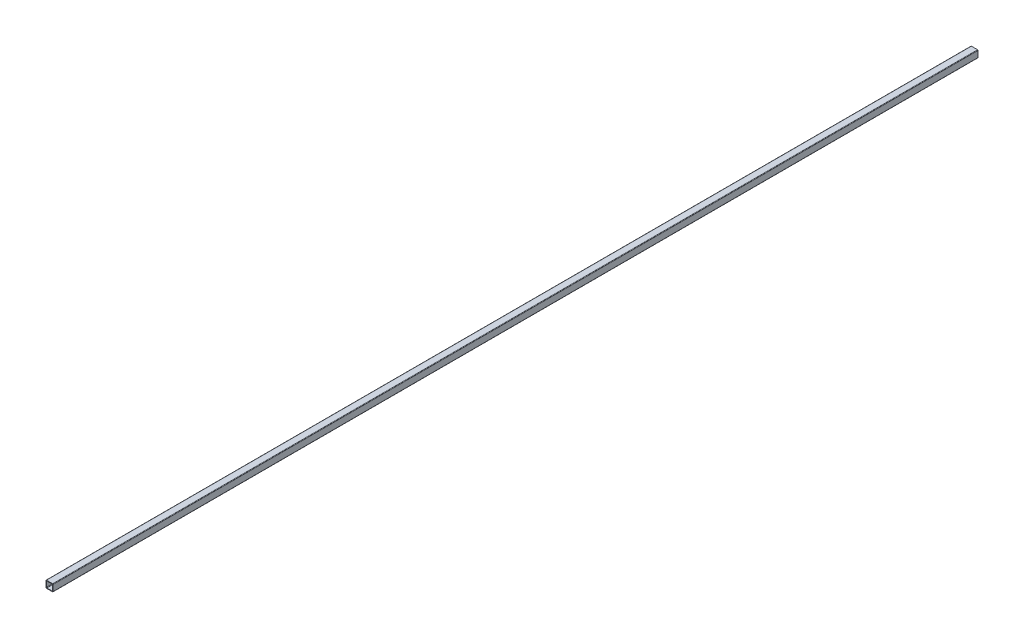
ISO-10303-21;
HEADER;
FILE_DESCRIPTION(('STEP AP214'),'2;1');
FILE_NAME('part.step','',(''),(''),'','','');
FILE_SCHEMA(('AUTOMOTIVE_DESIGN { 1 0 10303 214 1 1 1 1 }'));
ENDSEC;
DATA;
#1=APPLICATION_CONTEXT('core data for automotive mechanical design processes');
#2=APPLICATION_PROTOCOL_DEFINITION('international standard','automotive_design',2000,#1);
#3=PRODUCT_CONTEXT('',#1,'mechanical');
#4=PRODUCT('Part','Part','',(#3));
#5=PRODUCT_RELATED_PRODUCT_CATEGORY('part','',(#4));
#6=PRODUCT_DEFINITION_FORMATION('','',#4);
#7=PRODUCT_DEFINITION_CONTEXT('part definition',#1,'design');
#8=PRODUCT_DEFINITION('design','',#6,#7);
#9=PRODUCT_DEFINITION_SHAPE('','',#8);
#10=(LENGTH_UNIT() NAMED_UNIT(*) SI_UNIT(.MILLI.,.METRE.));
#11=(NAMED_UNIT(*) PLANE_ANGLE_UNIT() SI_UNIT($,.RADIAN.));
#12=(NAMED_UNIT(*) SI_UNIT($,.STERADIAN.) SOLID_ANGLE_UNIT());
#13=UNCERTAINTY_MEASURE_WITH_UNIT(LENGTH_MEASURE(1.E-05),#10,'distance_accuracy_value','');
#14=(GEOMETRIC_REPRESENTATION_CONTEXT(3) GLOBAL_UNCERTAINTY_ASSIGNED_CONTEXT((#13)) GLOBAL_UNIT_ASSIGNED_CONTEXT((#10,
#11,#12)) REPRESENTATION_CONTEXT('',''));
#15=CARTESIAN_POINT('',(0.,0.,0.));
#16=DIRECTION('',(0.,0.,1.));
#17=DIRECTION('',(1.,0.,0.));
#18=AXIS2_PLACEMENT_3D('',#15,#16,#17);
#19=CARTESIAN_POINT('',(2.54,-35.56,5000.));
#20=DIRECTION('',(0.,0.,1.));
#21=DIRECTION('',(1.,0.,0.));
#22=AXIS2_PLACEMENT_3D('',#19,#20,#21);
#23=PLANE('',#22);
#24=CARTESIAN_POINT('',(2.54,-35.56,5000.));
#25=DIRECTION('',(0.,0.,1.));
#26=DIRECTION('',(1.,0.,0.));
#27=AXIS2_PLACEMENT_3D('',#24,#25,#26);
#28=CIRCLE('',#27,2.54);
#29=CARTESIAN_POINT('',(0.,-35.56,5000.));
#30=VERTEX_POINT('',#29);
#31=CARTESIAN_POINT('',(2.54000000000002,-38.1,5000.));
#32=VERTEX_POINT('',#31);
#33=EDGE_CURVE('E212',#30,#32,#28,.T.);
#34=ORIENTED_EDGE('',*,*,#33,.T.);
#35=DIRECTION('',(1.,0.,0.));
#36=VECTOR('',#35,1.);
#37=CARTESIAN_POINT('',(2.54000000000002,-38.1,5000.));
#38=LINE('',#37,#36);
#39=CARTESIAN_POINT('',(35.56,-38.1,5000.));
#40=VERTEX_POINT('',#39);
#41=EDGE_CURVE('E215',#32,#40,#38,.T.);
#42=ORIENTED_EDGE('',*,*,#41,.T.);
#43=CARTESIAN_POINT('',(35.56,-35.56,5000.));
#44=DIRECTION('',(0.,0.,1.));
#45=DIRECTION('',(-1.,0.,0.));
#46=AXIS2_PLACEMENT_3D('',#43,#44,#45);
#47=CIRCLE('',#46,2.54);
#48=CARTESIAN_POINT('',(38.1,-35.56,5000.));
#49=VERTEX_POINT('',#48);
#50=EDGE_CURVE('E218',#40,#49,#47,.T.);
#51=ORIENTED_EDGE('',*,*,#50,.T.);
#52=DIRECTION('',(0.,1.,0.));
#53=VECTOR('',#52,1.);
#54=CARTESIAN_POINT('',(38.1,-2.54000000000002,5000.));
#55=LINE('',#54,#53);
#56=CARTESIAN_POINT('',(38.1,-2.54000000000002,5000.));
#57=VERTEX_POINT('',#56);
#58=EDGE_CURVE('E220',#49,#57,#55,.T.);
#59=ORIENTED_EDGE('',*,*,#58,.T.);
#60=CARTESIAN_POINT('',(35.56,-2.54,5000.));
#61=DIRECTION('',(0.,0.,1.));
#62=DIRECTION('',(1.,0.,0.));
#63=AXIS2_PLACEMENT_3D('',#60,#61,#62);
#64=CIRCLE('',#63,2.54);
#65=CARTESIAN_POINT('',(35.56,0.,5000.));
#66=VERTEX_POINT('',#65);
#67=EDGE_CURVE('E222',#57,#66,#64,.T.);
#68=ORIENTED_EDGE('',*,*,#67,.T.);
#69=DIRECTION('',(-1.,0.,0.));
#70=VECTOR('',#69,1.);
#71=CARTESIAN_POINT('',(2.54000000000002,0.,5000.));
#72=LINE('',#71,#70);
#73=CARTESIAN_POINT('',(2.54000000000002,0.,5000.));
#74=VERTEX_POINT('',#73);
#75=EDGE_CURVE('E224',#66,#74,#72,.T.);
#76=ORIENTED_EDGE('',*,*,#75,.T.);
#77=CARTESIAN_POINT('',(2.54,-2.54,5000.));
#78=DIRECTION('',(0.,0.,1.));
#79=DIRECTION('',(-1.,0.,0.));
#80=AXIS2_PLACEMENT_3D('',#77,#78,#79);
#81=CIRCLE('',#80,2.54);
#82=CARTESIAN_POINT('',(0.,-2.54000000000002,5000.));
#83=VERTEX_POINT('',#82);
#84=EDGE_CURVE('E226',#74,#83,#81,.T.);
#85=ORIENTED_EDGE('',*,*,#84,.T.);
#86=DIRECTION('',(0.,-1.,0.));
#87=VECTOR('',#86,1.);
#88=CARTESIAN_POINT('',(0.,-2.54000000000002,5000.));
#89=LINE('',#88,#87);
#90=EDGE_CURVE('E228',#83,#30,#89,.T.);
#91=ORIENTED_EDGE('',*,*,#90,.T.);
#92=EDGE_LOOP('',(#34,#42,#51,#59,#68,#76,#85,#91));
#93=FACE_BOUND('',#92,.T.);
#94=DIRECTION('',(1.,0.,0.));
#95=VECTOR('',#94,1.);
#96=CARTESIAN_POINT('',(5.30860000000002,-35.3314,5000.));
#97=LINE('',#96,#95);
#98=CARTESIAN_POINT('',(5.30860000000002,-35.3314,5000.));
#99=VERTEX_POINT('',#98);
#100=CARTESIAN_POINT('',(32.7914,-35.3314,5000.));
#101=VERTEX_POINT('',#100);
#102=EDGE_CURVE('E155',#99,#101,#97,.T.);
#103=ORIENTED_EDGE('',*,*,#102,.F.);
#104=CARTESIAN_POINT('',(5.3086,-32.7914,5000.));
#105=DIRECTION('',(0.,0.,1.));
#106=DIRECTION('',(1.,0.,0.));
#107=AXIS2_PLACEMENT_3D('',#104,#105,#106);
#108=CIRCLE('',#107,2.54);
#109=CARTESIAN_POINT('',(2.7686,-32.7914,5000.));
#110=VERTEX_POINT('',#109);
#111=EDGE_CURVE('E147',#110,#99,#108,.T.);
#112=ORIENTED_EDGE('',*,*,#111,.F.);
#113=DIRECTION('',(0.,-1.,0.));
#114=VECTOR('',#113,1.);
#115=CARTESIAN_POINT('',(2.7686,-5.30860000000002,5000.));
#116=LINE('',#115,#114);
#117=CARTESIAN_POINT('',(2.7686,-5.30860000000002,5000.));
#118=VERTEX_POINT('',#117);
#119=EDGE_CURVE('E180',#118,#110,#116,.T.);
#120=ORIENTED_EDGE('',*,*,#119,.F.);
#121=CARTESIAN_POINT('',(5.3086,-5.3086,5000.));
#122=DIRECTION('',(0.,0.,1.));
#123=DIRECTION('',(1.,0.,0.));
#124=AXIS2_PLACEMENT_3D('',#121,#122,#123);
#125=CIRCLE('',#124,2.54);
#126=CARTESIAN_POINT('',(5.30860000000002,-2.7686,5000.));
#127=VERTEX_POINT('',#126);
#128=EDGE_CURVE('E178',#127,#118,#125,.T.);
#129=ORIENTED_EDGE('',*,*,#128,.F.);
#130=DIRECTION('',(-1.,0.,0.));
#131=VECTOR('',#130,1.);
#132=CARTESIAN_POINT('',(5.30860000000002,-2.7686,5000.));
#133=LINE('',#132,#131);
#134=CARTESIAN_POINT('',(32.7914,-2.7686,5000.));
#135=VERTEX_POINT('',#134);
#136=EDGE_CURVE('E176',#135,#127,#133,.T.);
#137=ORIENTED_EDGE('',*,*,#136,.F.);
#138=CARTESIAN_POINT('',(32.7914,-5.3086,5000.));
#139=DIRECTION('',(0.,0.,1.));
#140=DIRECTION('',(1.,0.,0.));
#141=AXIS2_PLACEMENT_3D('',#138,#139,#140);
#142=CIRCLE('',#141,2.54);
#143=CARTESIAN_POINT('',(35.3314,-5.30860000000002,5000.));
#144=VERTEX_POINT('',#143);
#145=EDGE_CURVE('E174',#144,#135,#142,.T.);
#146=ORIENTED_EDGE('',*,*,#145,.F.);
#147=DIRECTION('',(0.,1.,0.));
#148=VECTOR('',#147,1.);
#149=CARTESIAN_POINT('',(35.3314,-5.30860000000002,5000.));
#150=LINE('',#149,#148);
#151=CARTESIAN_POINT('',(35.3314,-32.7914,5000.));
#152=VERTEX_POINT('',#151);
#153=EDGE_CURVE('E170',#152,#144,#150,.T.);
#154=ORIENTED_EDGE('',*,*,#153,.F.);
#155=CARTESIAN_POINT('',(32.7914,-32.7914,5000.));
#156=DIRECTION('',(0.,0.,1.));
#157=DIRECTION('',(1.,0.,0.));
#158=AXIS2_PLACEMENT_3D('',#155,#156,#157);
#159=CIRCLE('',#158,2.54);
#160=EDGE_CURVE('E168',#101,#152,#159,.T.);
#161=ORIENTED_EDGE('',*,*,#160,.F.);
#162=EDGE_LOOP('',(#103,#112,#120,#129,#137,#146,#154,#161));
#163=FACE_BOUND('',#162,.T.);
#164=ADVANCED_FACE('F34',(#93,#163),#23,.T.);
#165=CARTESIAN_POINT('',(2.54,-35.56,0.));
#166=DIRECTION('',(0.,0.,1.));
#167=DIRECTION('',(1.,0.,0.));
#168=AXIS2_PLACEMENT_3D('',#165,#166,#167);
#169=PLANE('',#168);
#170=CARTESIAN_POINT('',(2.54,-35.56,0.));
#171=DIRECTION('',(0.,0.,1.));
#172=DIRECTION('',(1.,0.,0.));
#173=AXIS2_PLACEMENT_3D('',#170,#171,#172);
#174=CIRCLE('',#173,2.54);
#175=CARTESIAN_POINT('',(0.,-35.56,0.));
#176=VERTEX_POINT('',#175);
#177=CARTESIAN_POINT('',(2.54000000000002,-38.1,0.));
#178=VERTEX_POINT('',#177);
#179=EDGE_CURVE('E163',#176,#178,#174,.T.);
#180=ORIENTED_EDGE('',*,*,#179,.F.);
#181=DIRECTION('',(0.,-1.,0.));
#182=VECTOR('',#181,1.);
#183=CARTESIAN_POINT('',(0.,-2.54000000000002,0.));
#184=LINE('',#183,#182);
#185=CARTESIAN_POINT('',(0.,-2.54000000000002,0.));
#186=VERTEX_POINT('',#185);
#187=EDGE_CURVE('E216',#186,#176,#184,.T.);
#188=ORIENTED_EDGE('',*,*,#187,.F.);
#189=CARTESIAN_POINT('',(2.54,-2.54,0.));
#190=DIRECTION('',(0.,0.,1.));
#191=DIRECTION('',(-1.,0.,0.));
#192=AXIS2_PLACEMENT_3D('',#189,#190,#191);
#193=CIRCLE('',#192,2.54);
#194=CARTESIAN_POINT('',(2.54000000000002,0.,0.));
#195=VERTEX_POINT('',#194);
#196=EDGE_CURVE('E243',#195,#186,#193,.T.);
#197=ORIENTED_EDGE('',*,*,#196,.F.);
#198=DIRECTION('',(-1.,0.,0.));
#199=VECTOR('',#198,1.);
#200=CARTESIAN_POINT('',(2.54000000000002,0.,0.));
#201=LINE('',#200,#199);
#202=CARTESIAN_POINT('',(35.56,0.,0.));
#203=VERTEX_POINT('',#202);
#204=EDGE_CURVE('E241',#203,#195,#201,.T.);
#205=ORIENTED_EDGE('',*,*,#204,.F.);
#206=CARTESIAN_POINT('',(35.56,-2.54,0.));
#207=DIRECTION('',(0.,0.,1.));
#208=DIRECTION('',(1.,0.,0.));
#209=AXIS2_PLACEMENT_3D('',#206,#207,#208);
#210=CIRCLE('',#209,2.54);
#211=CARTESIAN_POINT('',(38.1,-2.54000000000002,0.));
#212=VERTEX_POINT('',#211);
#213=EDGE_CURVE('E239',#212,#203,#210,.T.);
#214=ORIENTED_EDGE('',*,*,#213,.F.);
#215=DIRECTION('',(0.,1.,0.));
#216=VECTOR('',#215,1.);
#217=CARTESIAN_POINT('',(38.1,-2.54000000000002,0.));
#218=LINE('',#217,#216);
#219=CARTESIAN_POINT('',(38.1,-35.56,0.));
#220=VERTEX_POINT('',#219);
#221=EDGE_CURVE('E237',#220,#212,#218,.T.);
#222=ORIENTED_EDGE('',*,*,#221,.F.);
#223=CARTESIAN_POINT('',(35.56,-35.56,0.));
#224=DIRECTION('',(0.,0.,1.));
#225=DIRECTION('',(-1.,0.,0.));
#226=AXIS2_PLACEMENT_3D('',#223,#224,#225);
#227=CIRCLE('',#226,2.54);
#228=CARTESIAN_POINT('',(35.56,-38.1,0.));
#229=VERTEX_POINT('',#228);
#230=EDGE_CURVE('E235',#229,#220,#227,.T.);
#231=ORIENTED_EDGE('',*,*,#230,.F.);
#232=DIRECTION('',(1.,0.,0.));
#233=VECTOR('',#232,1.);
#234=CARTESIAN_POINT('',(2.54000000000002,-38.1,0.));
#235=LINE('',#234,#233);
#236=EDGE_CURVE('E233',#178,#229,#235,.T.);
#237=ORIENTED_EDGE('',*,*,#236,.F.);
#238=EDGE_LOOP('',(#180,#188,#197,#205,#214,#222,#231,#237));
#239=FACE_BOUND('',#238,.T.);
#240=CARTESIAN_POINT('',(5.3086,-32.7914,0.));
#241=DIRECTION('',(0.,0.,1.));
#242=DIRECTION('',(1.,0.,0.));
#243=AXIS2_PLACEMENT_3D('',#240,#241,#242);
#244=CIRCLE('',#243,2.54);
#245=CARTESIAN_POINT('',(2.7686,-32.7914,0.));
#246=VERTEX_POINT('',#245);
#247=CARTESIAN_POINT('',(5.30860000000002,-35.3314,0.));
#248=VERTEX_POINT('',#247);
#249=EDGE_CURVE('E57',#246,#248,#244,.T.);
#250=ORIENTED_EDGE('',*,*,#249,.T.);
#251=DIRECTION('',(1.,0.,0.));
#252=VECTOR('',#251,1.);
#253=CARTESIAN_POINT('',(5.30860000000002,-35.3314,0.));
#254=LINE('',#253,#252);
#255=CARTESIAN_POINT('',(32.7914,-35.3314,0.));
#256=VERTEX_POINT('',#255);
#257=EDGE_CURVE('E162',#248,#256,#254,.T.);
#258=ORIENTED_EDGE('',*,*,#257,.T.);
#259=CARTESIAN_POINT('',(32.7914,-32.7914,0.));
#260=DIRECTION('',(0.,0.,1.));
#261=DIRECTION('',(1.,0.,0.));
#262=AXIS2_PLACEMENT_3D('',#259,#260,#261);
#263=CIRCLE('',#262,2.54);
#264=CARTESIAN_POINT('',(35.3314,-32.7914,0.));
#265=VERTEX_POINT('',#264);
#266=EDGE_CURVE('E184',#256,#265,#263,.T.);
#267=ORIENTED_EDGE('',*,*,#266,.T.);
#268=DIRECTION('',(0.,1.,0.));
#269=VECTOR('',#268,1.);
#270=CARTESIAN_POINT('',(35.3314,-5.30860000000002,0.));
#271=LINE('',#270,#269);
#272=CARTESIAN_POINT('',(35.3314,-5.30860000000002,0.));
#273=VERTEX_POINT('',#272);
#274=EDGE_CURVE('E187',#265,#273,#271,.T.);
#275=ORIENTED_EDGE('',*,*,#274,.T.);
#276=CARTESIAN_POINT('',(32.7914,-5.3086,0.));
#277=DIRECTION('',(0.,0.,1.));
#278=DIRECTION('',(1.,0.,0.));
#279=AXIS2_PLACEMENT_3D('',#276,#277,#278);
#280=CIRCLE('',#279,2.54);
#281=CARTESIAN_POINT('',(32.7914,-2.7686,0.));
#282=VERTEX_POINT('',#281);
#283=EDGE_CURVE('E190',#273,#282,#280,.T.);
#284=ORIENTED_EDGE('',*,*,#283,.T.);
#285=DIRECTION('',(-1.,0.,0.));
#286=VECTOR('',#285,1.);
#287=CARTESIAN_POINT('',(5.30860000000002,-2.7686,0.));
#288=LINE('',#287,#286);
#289=CARTESIAN_POINT('',(5.30860000000002,-2.7686,0.));
#290=VERTEX_POINT('',#289);
#291=EDGE_CURVE('E193',#282,#290,#288,.T.);
#292=ORIENTED_EDGE('',*,*,#291,.T.);
#293=CARTESIAN_POINT('',(5.3086,-5.3086,0.));
#294=DIRECTION('',(0.,0.,1.));
#295=DIRECTION('',(1.,0.,0.));
#296=AXIS2_PLACEMENT_3D('',#293,#294,#295);
#297=CIRCLE('',#296,2.54);
#298=CARTESIAN_POINT('',(2.7686,-5.30860000000002,0.));
#299=VERTEX_POINT('',#298);
#300=EDGE_CURVE('E196',#290,#299,#297,.T.);
#301=ORIENTED_EDGE('',*,*,#300,.T.);
#302=DIRECTION('',(0.,-1.,0.));
#303=VECTOR('',#302,1.);
#304=CARTESIAN_POINT('',(2.7686,-5.30860000000002,0.));
#305=LINE('',#304,#303);
#306=EDGE_CURVE('E156',#299,#246,#305,.T.);
#307=ORIENTED_EDGE('',*,*,#306,.T.);
#308=EDGE_LOOP('',(#250,#258,#267,#275,#284,#292,#301,#307));
#309=FACE_BOUND('',#308,.T.);
#310=ADVANCED_FACE('F273',(#239,#309),#169,.F.);
#311=CARTESIAN_POINT('',(2.54,-35.56,5000.));
#312=DIRECTION('',(0.,0.,-1.));
#313=DIRECTION('',(-1.,0.,0.));
#314=AXIS2_PLACEMENT_3D('',#311,#312,#313);
#315=CYLINDRICAL_SURFACE('',#314,2.54);
#316=ORIENTED_EDGE('',*,*,#179,.T.);
#317=DIRECTION('',(0.,0.,-1.));
#318=VECTOR('',#317,1.);
#319=CARTESIAN_POINT('',(2.54000000000002,-38.1,5000.));
#320=LINE('',#319,#318);
#321=EDGE_CURVE('E11',#32,#178,#320,.T.);
#322=ORIENTED_EDGE('',*,*,#321,.F.);
#323=ORIENTED_EDGE('',*,*,#33,.F.);
#324=DIRECTION('',(0.,0.,-1.));
#325=VECTOR('',#324,1.);
#326=CARTESIAN_POINT('',(0.,-35.56,5000.));
#327=LINE('',#326,#325);
#328=EDGE_CURVE('E230',#30,#176,#327,.T.);
#329=ORIENTED_EDGE('',*,*,#328,.T.);
#330=EDGE_LOOP('',(#316,#322,#323,#329));
#331=FACE_BOUND('',#330,.T.);
#332=ADVANCED_FACE('F36',(#331),#315,.T.);
#333=CARTESIAN_POINT('',(2.54000000000002,-38.1,5000.));
#334=DIRECTION('',(0.,1.,0.));
#335=DIRECTION('',(0.,0.,1.));
#336=AXIS2_PLACEMENT_3D('',#333,#334,#335);
#337=PLANE('',#336);
#338=ORIENTED_EDGE('',*,*,#236,.T.);
#339=DIRECTION('',(0.,0.,-1.));
#340=VECTOR('',#339,1.);
#341=CARTESIAN_POINT('',(35.56,-38.1,5000.));
#342=LINE('',#341,#340);
#343=EDGE_CURVE('E42',#40,#229,#342,.T.);
#344=ORIENTED_EDGE('',*,*,#343,.F.);
#345=ORIENTED_EDGE('',*,*,#41,.F.);
#346=ORIENTED_EDGE('',*,*,#321,.T.);
#347=EDGE_LOOP('',(#338,#344,#345,#346));
#348=FACE_BOUND('',#347,.T.);
#349=ADVANCED_FACE('F290',(#348),#337,.F.);
#350=CARTESIAN_POINT('',(35.56,-35.56,5000.));
#351=DIRECTION('',(0.,0.,-1.));
#352=DIRECTION('',(-1.,0.,0.));
#353=AXIS2_PLACEMENT_3D('',#350,#351,#352);
#354=CYLINDRICAL_SURFACE('',#353,2.54);
#355=ORIENTED_EDGE('',*,*,#230,.T.);
#356=DIRECTION('',(0.,0.,-1.));
#357=VECTOR('',#356,1.);
#358=CARTESIAN_POINT('',(38.1,-35.56,5000.));
#359=LINE('',#358,#357);
#360=EDGE_CURVE('E260',#49,#220,#359,.T.);
#361=ORIENTED_EDGE('',*,*,#360,.F.);
#362=ORIENTED_EDGE('',*,*,#50,.F.);
#363=ORIENTED_EDGE('',*,*,#343,.T.);
#364=EDGE_LOOP('',(#355,#361,#362,#363));
#365=FACE_BOUND('',#364,.T.);
#366=ADVANCED_FACE('F267',(#365),#354,.T.);
#367=CARTESIAN_POINT('',(38.1,-2.54000000000002,5000.));
#368=DIRECTION('',(-1.,0.,0.));
#369=DIRECTION('',(0.,-1.,0.));
#370=AXIS2_PLACEMENT_3D('',#367,#368,#369);
#371=PLANE('',#370);
#372=ORIENTED_EDGE('',*,*,#221,.T.);
#373=DIRECTION('',(0.,0.,-1.));
#374=VECTOR('',#373,1.);
#375=CARTESIAN_POINT('',(38.1,-2.54000000000002,5000.));
#376=LINE('',#375,#374);
#377=EDGE_CURVE('E257',#57,#212,#376,.T.);
#378=ORIENTED_EDGE('',*,*,#377,.F.);
#379=ORIENTED_EDGE('',*,*,#58,.F.);
#380=ORIENTED_EDGE('',*,*,#360,.T.);
#381=EDGE_LOOP('',(#372,#378,#379,#380));
#382=FACE_BOUND('',#381,.T.);
#383=ADVANCED_FACE('F279',(#382),#371,.F.);
#384=CARTESIAN_POINT('',(35.56,-2.54,5000.));
#385=DIRECTION('',(0.,0.,-1.));
#386=DIRECTION('',(-1.,0.,0.));
#387=AXIS2_PLACEMENT_3D('',#384,#385,#386);
#388=CYLINDRICAL_SURFACE('',#387,2.54);
#389=ORIENTED_EDGE('',*,*,#213,.T.);
#390=DIRECTION('',(0.,0.,-1.));
#391=VECTOR('',#390,1.);
#392=CARTESIAN_POINT('',(35.56,0.,5000.));
#393=LINE('',#392,#391);
#394=EDGE_CURVE('E254',#66,#203,#393,.T.);
#395=ORIENTED_EDGE('',*,*,#394,.F.);
#396=ORIENTED_EDGE('',*,*,#67,.F.);
#397=ORIENTED_EDGE('',*,*,#377,.T.);
#398=EDGE_LOOP('',(#389,#395,#396,#397));
#399=FACE_BOUND('',#398,.T.);
#400=ADVANCED_FACE('F283',(#399),#388,.T.);
#401=CARTESIAN_POINT('',(2.54000000000002,0.,5000.));
#402=DIRECTION('',(0.,-1.,0.));
#403=DIRECTION('',(0.,0.,-1.));
#404=AXIS2_PLACEMENT_3D('',#401,#402,#403);
#405=PLANE('',#404);
#406=ORIENTED_EDGE('',*,*,#204,.T.);
#407=DIRECTION('',(0.,0.,-1.));
#408=VECTOR('',#407,1.);
#409=CARTESIAN_POINT('',(2.54000000000002,0.,5000.));
#410=LINE('',#409,#408);
#411=EDGE_CURVE('E251',#74,#195,#410,.T.);
#412=ORIENTED_EDGE('',*,*,#411,.F.);
#413=ORIENTED_EDGE('',*,*,#75,.F.);
#414=ORIENTED_EDGE('',*,*,#394,.T.);
#415=EDGE_LOOP('',(#406,#412,#413,#414));
#416=FACE_BOUND('',#415,.T.);
#417=ADVANCED_FACE('F303',(#416),#405,.F.);
#418=CARTESIAN_POINT('',(2.54,-2.54,5000.));
#419=DIRECTION('',(0.,0.,-1.));
#420=DIRECTION('',(-1.,0.,0.));
#421=AXIS2_PLACEMENT_3D('',#418,#419,#420);
#422=CYLINDRICAL_SURFACE('',#421,2.54);
#423=ORIENTED_EDGE('',*,*,#196,.T.);
#424=DIRECTION('',(0.,0.,-1.));
#425=VECTOR('',#424,1.);
#426=CARTESIAN_POINT('',(0.,-2.54000000000002,5000.));
#427=LINE('',#426,#425);
#428=EDGE_CURVE('E248',#83,#186,#427,.T.);
#429=ORIENTED_EDGE('',*,*,#428,.F.);
#430=ORIENTED_EDGE('',*,*,#84,.F.);
#431=ORIENTED_EDGE('',*,*,#411,.T.);
#432=EDGE_LOOP('',(#423,#429,#430,#431));
#433=FACE_BOUND('',#432,.T.);
#434=ADVANCED_FACE('F301',(#433),#422,.T.);
#435=CARTESIAN_POINT('',(0.,-2.54000000000002,5000.));
#436=DIRECTION('',(1.,0.,0.));
#437=DIRECTION('',(0.,1.,0.));
#438=AXIS2_PLACEMENT_3D('',#435,#436,#437);
#439=PLANE('',#438);
#440=ORIENTED_EDGE('',*,*,#187,.T.);
#441=ORIENTED_EDGE('',*,*,#328,.F.);
#442=ORIENTED_EDGE('',*,*,#90,.F.);
#443=ORIENTED_EDGE('',*,*,#428,.T.);
#444=EDGE_LOOP('',(#440,#441,#442,#443));
#445=FACE_BOUND('',#444,.T.);
#446=ADVANCED_FACE('F296',(#445),#439,.F.);
#447=CARTESIAN_POINT('',(5.3086,-32.7914,5000.));
#448=DIRECTION('',(0.,0.,-1.));
#449=DIRECTION('',(-1.,0.,0.));
#450=AXIS2_PLACEMENT_3D('',#447,#448,#449);
#451=CYLINDRICAL_SURFACE('',#450,2.54);
#452=ORIENTED_EDGE('',*,*,#249,.F.);
#453=DIRECTION('',(0.,0.,-1.));
#454=VECTOR('',#453,1.);
#455=CARTESIAN_POINT('',(2.7686,-32.7914,5000.));
#456=LINE('',#455,#454);
#457=EDGE_CURVE('E151',#110,#246,#456,.T.);
#458=ORIENTED_EDGE('',*,*,#457,.F.);
#459=ORIENTED_EDGE('',*,*,#111,.T.);
#460=DIRECTION('',(0.,0.,-1.));
#461=VECTOR('',#460,1.);
#462=CARTESIAN_POINT('',(5.30860000000002,-35.3314,5000.));
#463=LINE('',#462,#461);
#464=EDGE_CURVE('E150',#99,#248,#463,.T.);
#465=ORIENTED_EDGE('',*,*,#464,.T.);
#466=EDGE_LOOP('',(#452,#458,#459,#465));
#467=FACE_BOUND('',#466,.T.);
#468=ADVANCED_FACE('F149',(#467),#451,.F.);
#469=CARTESIAN_POINT('',(5.30860000000002,-35.3314,5000.));
#470=DIRECTION('',(0.,1.,0.));
#471=DIRECTION('',(0.,0.,1.));
#472=AXIS2_PLACEMENT_3D('',#469,#470,#471);
#473=PLANE('',#472);
#474=ORIENTED_EDGE('',*,*,#257,.F.);
#475=ORIENTED_EDGE('',*,*,#464,.F.);
#476=ORIENTED_EDGE('',*,*,#102,.T.);
#477=DIRECTION('',(0.,0.,-1.));
#478=VECTOR('',#477,1.);
#479=CARTESIAN_POINT('',(32.7914,-35.3314,5000.));
#480=LINE('',#479,#478);
#481=EDGE_CURVE('E164',#101,#256,#480,.T.);
#482=ORIENTED_EDGE('',*,*,#481,.T.);
#483=EDGE_LOOP('',(#474,#475,#476,#482));
#484=FACE_BOUND('',#483,.T.);
#485=ADVANCED_FACE('F159',(#484),#473,.T.);
#486=CARTESIAN_POINT('',(32.7914,-32.7914,5000.));
#487=DIRECTION('',(0.,0.,-1.));
#488=DIRECTION('',(-1.,0.,0.));
#489=AXIS2_PLACEMENT_3D('',#486,#487,#488);
#490=CYLINDRICAL_SURFACE('',#489,2.54);
#491=ORIENTED_EDGE('',*,*,#266,.F.);
#492=ORIENTED_EDGE('',*,*,#481,.F.);
#493=ORIENTED_EDGE('',*,*,#160,.T.);
#494=DIRECTION('',(0.,0.,-1.));
#495=VECTOR('',#494,1.);
#496=CARTESIAN_POINT('',(35.3314,-32.7914,5000.));
#497=LINE('',#496,#495);
#498=EDGE_CURVE('E209',#152,#265,#497,.T.);
#499=ORIENTED_EDGE('',*,*,#498,.T.);
#500=EDGE_LOOP('',(#491,#492,#493,#499));
#501=FACE_BOUND('',#500,.T.);
#502=ADVANCED_FACE('F328',(#501),#490,.F.);
#503=CARTESIAN_POINT('',(35.3314,-5.30860000000002,5000.));
#504=DIRECTION('',(-1.,0.,0.));
#505=DIRECTION('',(0.,0.,1.));
#506=AXIS2_PLACEMENT_3D('',#503,#504,#505);
#507=PLANE('',#506);
#508=ORIENTED_EDGE('',*,*,#274,.F.);
#509=ORIENTED_EDGE('',*,*,#498,.F.);
#510=ORIENTED_EDGE('',*,*,#153,.T.);
#511=DIRECTION('',(0.,0.,-1.));
#512=VECTOR('',#511,1.);
#513=CARTESIAN_POINT('',(35.3314,-5.30860000000002,5000.));
#514=LINE('',#513,#512);
#515=EDGE_CURVE('E207',#144,#273,#514,.T.);
#516=ORIENTED_EDGE('',*,*,#515,.T.);
#517=EDGE_LOOP('',(#508,#509,#510,#516));
#518=FACE_BOUND('',#517,.T.);
#519=ADVANCED_FACE('F332',(#518),#507,.T.);
#520=CARTESIAN_POINT('',(32.7914,-5.3086,5000.));
#521=DIRECTION('',(0.,0.,-1.));
#522=DIRECTION('',(-1.,0.,0.));
#523=AXIS2_PLACEMENT_3D('',#520,#521,#522);
#524=CYLINDRICAL_SURFACE('',#523,2.54);
#525=ORIENTED_EDGE('',*,*,#283,.F.);
#526=ORIENTED_EDGE('',*,*,#515,.F.);
#527=ORIENTED_EDGE('',*,*,#145,.T.);
#528=DIRECTION('',(0.,0.,-1.));
#529=VECTOR('',#528,1.);
#530=CARTESIAN_POINT('',(32.7914,-2.7686,5000.));
#531=LINE('',#530,#529);
#532=EDGE_CURVE('E205',#135,#282,#531,.T.);
#533=ORIENTED_EDGE('',*,*,#532,.T.);
#534=EDGE_LOOP('',(#525,#526,#527,#533));
#535=FACE_BOUND('',#534,.T.);
#536=ADVANCED_FACE('F338',(#535),#524,.F.);
#537=CARTESIAN_POINT('',(5.30860000000002,-2.7686,5000.));
#538=DIRECTION('',(0.,-1.,0.));
#539=DIRECTION('',(0.,0.,-1.));
#540=AXIS2_PLACEMENT_3D('',#537,#538,#539);
#541=PLANE('',#540);
#542=ORIENTED_EDGE('',*,*,#291,.F.);
#543=ORIENTED_EDGE('',*,*,#532,.F.);
#544=ORIENTED_EDGE('',*,*,#136,.T.);
#545=DIRECTION('',(0.,0.,-1.));
#546=VECTOR('',#545,1.);
#547=CARTESIAN_POINT('',(5.30860000000002,-2.7686,5000.));
#548=LINE('',#547,#546);
#549=EDGE_CURVE('E203',#127,#290,#548,.T.);
#550=ORIENTED_EDGE('',*,*,#549,.T.);
#551=EDGE_LOOP('',(#542,#543,#544,#550));
#552=FACE_BOUND('',#551,.T.);
#553=ADVANCED_FACE('F342',(#552),#541,.T.);
#554=CARTESIAN_POINT('',(5.3086,-5.3086,5000.));
#555=DIRECTION('',(0.,0.,-1.));
#556=DIRECTION('',(-1.,0.,0.));
#557=AXIS2_PLACEMENT_3D('',#554,#555,#556);
#558=CYLINDRICAL_SURFACE('',#557,2.54);
#559=ORIENTED_EDGE('',*,*,#300,.F.);
#560=ORIENTED_EDGE('',*,*,#549,.F.);
#561=ORIENTED_EDGE('',*,*,#128,.T.);
#562=DIRECTION('',(0.,0.,-1.));
#563=VECTOR('',#562,1.);
#564=CARTESIAN_POINT('',(2.7686,-5.30860000000002,5000.));
#565=LINE('',#564,#563);
#566=EDGE_CURVE('E49',#118,#299,#565,.T.);
#567=ORIENTED_EDGE('',*,*,#566,.T.);
#568=EDGE_LOOP('',(#559,#560,#561,#567));
#569=FACE_BOUND('',#568,.T.);
#570=ADVANCED_FACE('F346',(#569),#558,.F.);
#571=CARTESIAN_POINT('',(2.7686,-5.30860000000002,5000.));
#572=DIRECTION('',(1.,0.,0.));
#573=DIRECTION('',(0.,0.,-1.));
#574=AXIS2_PLACEMENT_3D('',#571,#572,#573);
#575=PLANE('',#574);
#576=ORIENTED_EDGE('',*,*,#306,.F.);
#577=ORIENTED_EDGE('',*,*,#566,.F.);
#578=ORIENTED_EDGE('',*,*,#119,.T.);
#579=ORIENTED_EDGE('',*,*,#457,.T.);
#580=EDGE_LOOP('',(#576,#577,#578,#579));
#581=FACE_BOUND('',#580,.T.);
#582=ADVANCED_FACE('F350',(#581),#575,.T.);
#583=CLOSED_SHELL('',(#164,#310,#332,#349,#366,#383,#400,#417,#434,#446,#468,#485,#502,#519,
#536,#553,#570,#582));
#584=MANIFOLD_SOLID_BREP('B2',#583);
#585=ADVANCED_BREP_SHAPE_REPRESENTATION('',(#18,#584),#14);
#586=SHAPE_DEFINITION_REPRESENTATION(#9,#585);
ENDSEC;
END-ISO-10303-21;
